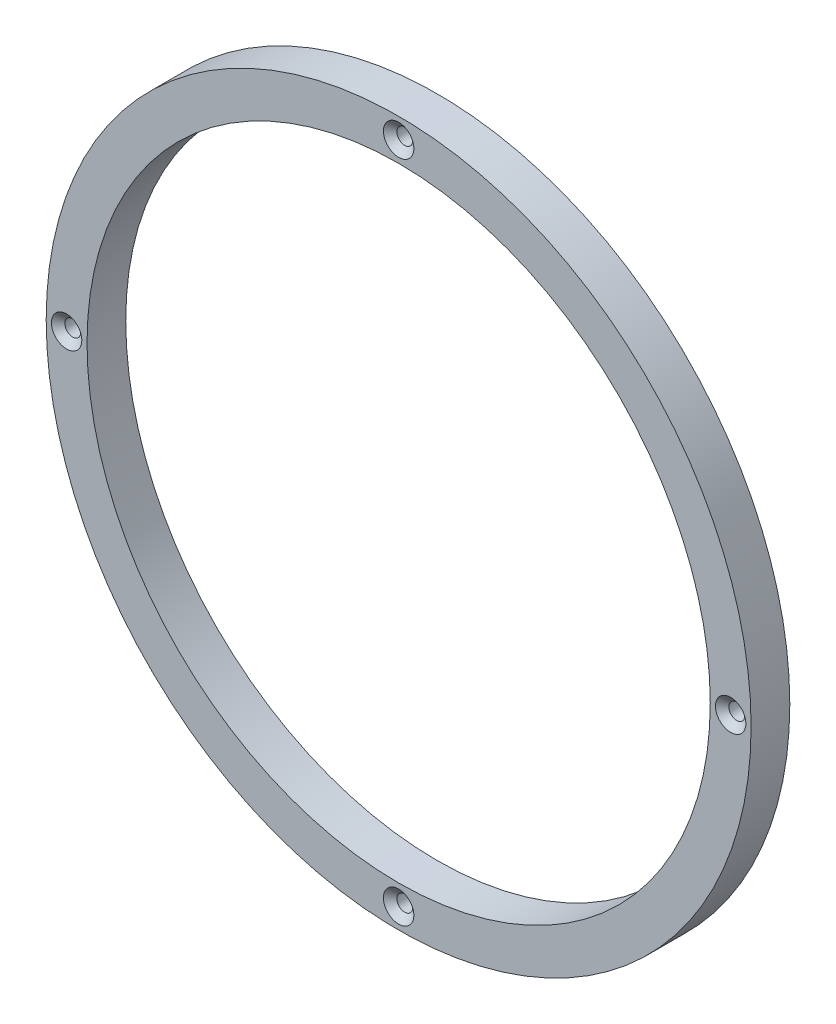
ISO-10303-21;
HEADER;
FILE_DESCRIPTION(('STEP AP214'),'2;1');
FILE_NAME('part.step','',(''),(''),'','','');
FILE_SCHEMA(('AUTOMOTIVE_DESIGN { 1 0 10303 214 1 1 1 1 }'));
ENDSEC;
DATA;
#1=APPLICATION_CONTEXT('core data for automotive mechanical design processes');
#2=APPLICATION_PROTOCOL_DEFINITION('international standard','automotive_design',2000,#1);
#3=PRODUCT_CONTEXT('',#1,'mechanical');
#4=PRODUCT('Part','Part','',(#3));
#5=PRODUCT_RELATED_PRODUCT_CATEGORY('part','',(#4));
#6=PRODUCT_DEFINITION_FORMATION('','',#4);
#7=PRODUCT_DEFINITION_CONTEXT('part definition',#1,'design');
#8=PRODUCT_DEFINITION('design','',#6,#7);
#9=PRODUCT_DEFINITION_SHAPE('','',#8);
#10=(LENGTH_UNIT() NAMED_UNIT(*) SI_UNIT(.MILLI.,.METRE.));
#11=(NAMED_UNIT(*) PLANE_ANGLE_UNIT() SI_UNIT($,.RADIAN.));
#12=(NAMED_UNIT(*) SI_UNIT($,.STERADIAN.) SOLID_ANGLE_UNIT());
#13=UNCERTAINTY_MEASURE_WITH_UNIT(LENGTH_MEASURE(1.E-05),#10,'distance_accuracy_value','');
#14=(GEOMETRIC_REPRESENTATION_CONTEXT(3) GLOBAL_UNCERTAINTY_ASSIGNED_CONTEXT((#13)) GLOBAL_UNIT_ASSIGNED_CONTEXT((#10,
#11,#12)) REPRESENTATION_CONTEXT('',''));
#15=CARTESIAN_POINT('',(0.,0.,0.));
#16=DIRECTION('',(0.,0.,1.));
#17=DIRECTION('',(1.,0.,0.));
#18=AXIS2_PLACEMENT_3D('',#15,#16,#17);
#19=CARTESIAN_POINT('',(0.,0.,12.446));
#20=DIRECTION('',(0.,0.,-1.));
#21=DIRECTION('',(-1.,0.,0.));
#22=AXIS2_PLACEMENT_3D('',#19,#20,#21);
#23=CYLINDRICAL_SURFACE('',#22,100.203);
#24=CARTESIAN_POINT('',(0.,0.,12.446));
#25=DIRECTION('',(0.,0.,1.));
#26=DIRECTION('',(1.,0.,0.));
#27=AXIS2_PLACEMENT_3D('',#24,#25,#26);
#28=CIRCLE('',#27,100.203);
#29=CARTESIAN_POINT('',(100.203,0.,12.446));
#30=VERTEX_POINT('',#29);
#31=EDGE_CURVE('E42',#30,#30,#28,.T.);
#32=ORIENTED_EDGE('',*,*,#31,.T.);
#33=EDGE_LOOP('',(#32));
#34=FACE_BOUND('',#33,.T.);
#35=CARTESIAN_POINT('',(0.,0.,0.));
#36=DIRECTION('',(0.,0.,1.));
#37=DIRECTION('',(1.,0.,0.));
#38=AXIS2_PLACEMENT_3D('',#35,#36,#37);
#39=CIRCLE('',#38,100.203);
#40=CARTESIAN_POINT('',(100.203,0.,0.));
#41=VERTEX_POINT('',#40);
#42=EDGE_CURVE('E49',#41,#41,#39,.T.);
#43=ORIENTED_EDGE('',*,*,#42,.F.);
#44=EDGE_LOOP('',(#43));
#45=FACE_BOUND('',#44,.T.);
#46=ADVANCED_FACE('F35',(#34,#45),#23,.F.);
#47=CARTESIAN_POINT('',(0.,0.,12.446));
#48=DIRECTION('',(0.,0.,-1.));
#49=DIRECTION('',(-1.,0.,0.));
#50=AXIS2_PLACEMENT_3D('',#47,#48,#49);
#51=CYLINDRICAL_SURFACE('',#50,113.3348);
#52=CARTESIAN_POINT('',(0.,0.,12.446));
#53=DIRECTION('',(0.,0.,1.));
#54=DIRECTION('',(1.,0.,0.));
#55=AXIS2_PLACEMENT_3D('',#52,#53,#54);
#56=CIRCLE('',#55,113.3348);
#57=CARTESIAN_POINT('',(113.3348,0.,12.446));
#58=VERTEX_POINT('',#57);
#59=EDGE_CURVE('E10',#58,#58,#56,.T.);
#60=ORIENTED_EDGE('',*,*,#59,.F.);
#61=EDGE_LOOP('',(#60));
#62=FACE_BOUND('',#61,.T.);
#63=CARTESIAN_POINT('',(0.,0.,0.));
#64=DIRECTION('',(0.,0.,1.));
#65=DIRECTION('',(1.,0.,0.));
#66=AXIS2_PLACEMENT_3D('',#63,#64,#65);
#67=CIRCLE('',#66,113.3348);
#68=CARTESIAN_POINT('',(113.3348,0.,0.));
#69=VERTEX_POINT('',#68);
#70=EDGE_CURVE('E38',#69,#69,#67,.T.);
#71=ORIENTED_EDGE('',*,*,#70,.T.);
#72=EDGE_LOOP('',(#71));
#73=FACE_BOUND('',#72,.T.);
#74=ADVANCED_FACE('F99',(#62,#73),#51,.T.);
#75=CARTESIAN_POINT('',(0.,0.,12.446));
#76=DIRECTION('',(0.,0.,1.));
#77=DIRECTION('',(1.,0.,0.));
#78=AXIS2_PLACEMENT_3D('',#75,#76,#77);
#79=PLANE('',#78);
#80=CARTESIAN_POINT('',(0.,-106.7689,12.446));
#81=DIRECTION('',(0.,0.,1.));
#82=DIRECTION('',(1.,0.,0.));
#83=AXIS2_PLACEMENT_3D('',#80,#81,#82);
#84=CIRCLE('',#83,4.8895);
#85=CARTESIAN_POINT('',(4.8895,-106.7689,12.446));
#86=VERTEX_POINT('',#85);
#87=EDGE_CURVE('E89',#86,#86,#84,.T.);
#88=ORIENTED_EDGE('',*,*,#87,.F.);
#89=EDGE_LOOP('',(#88));
#90=FACE_BOUND('',#89,.T.);
#91=CARTESIAN_POINT('',(0.,106.7689,12.446));
#92=DIRECTION('',(0.,0.,1.));
#93=DIRECTION('',(1.,0.,0.));
#94=AXIS2_PLACEMENT_3D('',#91,#92,#93);
#95=CIRCLE('',#94,4.8895);
#96=CARTESIAN_POINT('',(4.8895,106.7689,12.446));
#97=VERTEX_POINT('',#96);
#98=EDGE_CURVE('E80',#97,#97,#95,.T.);
#99=ORIENTED_EDGE('',*,*,#98,.F.);
#100=EDGE_LOOP('',(#99));
#101=FACE_BOUND('',#100,.T.);
#102=CARTESIAN_POINT('',(106.7689,0.,12.446));
#103=DIRECTION('',(0.,0.,1.));
#104=DIRECTION('',(1.,0.,0.));
#105=AXIS2_PLACEMENT_3D('',#102,#103,#104);
#106=CIRCLE('',#105,4.88950000000001);
#107=CARTESIAN_POINT('',(111.6584,0.,12.446));
#108=VERTEX_POINT('',#107);
#109=EDGE_CURVE('E71',#108,#108,#106,.T.);
#110=ORIENTED_EDGE('',*,*,#109,.F.);
#111=EDGE_LOOP('',(#110));
#112=FACE_BOUND('',#111,.T.);
#113=CARTESIAN_POINT('',(-106.7689,0.,12.446));
#114=DIRECTION('',(0.,0.,1.));
#115=DIRECTION('',(1.,0.,0.));
#116=AXIS2_PLACEMENT_3D('',#113,#114,#115);
#117=CIRCLE('',#116,4.88950000000001);
#118=CARTESIAN_POINT('',(-101.8794,0.,12.446));
#119=VERTEX_POINT('',#118);
#120=EDGE_CURVE('E60',#119,#119,#117,.T.);
#121=ORIENTED_EDGE('',*,*,#120,.F.);
#122=EDGE_LOOP('',(#121));
#123=FACE_BOUND('',#122,.T.);
#124=ORIENTED_EDGE('',*,*,#31,.F.);
#125=EDGE_LOOP('',(#124));
#126=FACE_BOUND('',#125,.T.);
#127=ORIENTED_EDGE('',*,*,#59,.T.);
#128=EDGE_LOOP('',(#127));
#129=FACE_BOUND('',#128,.T.);
#130=ADVANCED_FACE('F95',(#90,#101,#112,#123,#126,#129),#79,.T.);
#131=CARTESIAN_POINT('',(0.,0.,0.));
#132=DIRECTION('',(0.,0.,1.));
#133=DIRECTION('',(1.,0.,0.));
#134=AXIS2_PLACEMENT_3D('',#131,#132,#133);
#135=PLANE('',#134);
#136=CARTESIAN_POINT('',(0.,-106.7689,0.));
#137=DIRECTION('',(0.,0.,1.));
#138=DIRECTION('',(1.,0.,0.));
#139=AXIS2_PLACEMENT_3D('',#136,#137,#138);
#140=CIRCLE('',#139,2.5527);
#141=CARTESIAN_POINT('',(2.5527,-106.7689,0.));
#142=VERTEX_POINT('',#141);
#143=EDGE_CURVE('E83',#142,#142,#140,.T.);
#144=ORIENTED_EDGE('',*,*,#143,.T.);
#145=EDGE_LOOP('',(#144));
#146=FACE_BOUND('',#145,.T.);
#147=CARTESIAN_POINT('',(0.,106.7689,0.));
#148=DIRECTION('',(0.,0.,1.));
#149=DIRECTION('',(1.,0.,0.));
#150=AXIS2_PLACEMENT_3D('',#147,#148,#149);
#151=CIRCLE('',#150,2.5527);
#152=CARTESIAN_POINT('',(2.5527,106.7689,0.));
#153=VERTEX_POINT('',#152);
#154=EDGE_CURVE('E74',#153,#153,#151,.T.);
#155=ORIENTED_EDGE('',*,*,#154,.T.);
#156=EDGE_LOOP('',(#155));
#157=FACE_BOUND('',#156,.T.);
#158=CARTESIAN_POINT('',(106.7689,0.,0.));
#159=DIRECTION('',(0.,0.,1.));
#160=DIRECTION('',(1.,0.,0.));
#161=AXIS2_PLACEMENT_3D('',#158,#159,#160);
#162=CIRCLE('',#161,2.55270000000001);
#163=CARTESIAN_POINT('',(109.3216,0.,0.));
#164=VERTEX_POINT('',#163);
#165=EDGE_CURVE('E65',#164,#164,#162,.T.);
#166=ORIENTED_EDGE('',*,*,#165,.T.);
#167=EDGE_LOOP('',(#166));
#168=FACE_BOUND('',#167,.T.);
#169=CARTESIAN_POINT('',(-106.7689,0.,0.));
#170=DIRECTION('',(0.,0.,1.));
#171=DIRECTION('',(1.,0.,0.));
#172=AXIS2_PLACEMENT_3D('',#169,#170,#171);
#173=CIRCLE('',#172,2.55270000000001);
#174=CARTESIAN_POINT('',(-104.2162,0.,0.));
#175=VERTEX_POINT('',#174);
#176=EDGE_CURVE('E51',#175,#175,#173,.T.);
#177=ORIENTED_EDGE('',*,*,#176,.T.);
#178=EDGE_LOOP('',(#177));
#179=FACE_BOUND('',#178,.T.);
#180=ORIENTED_EDGE('',*,*,#42,.T.);
#181=EDGE_LOOP('',(#180));
#182=FACE_BOUND('',#181,.T.);
#183=ORIENTED_EDGE('',*,*,#70,.F.);
#184=EDGE_LOOP('',(#183));
#185=FACE_BOUND('',#184,.T.);
#186=ADVANCED_FACE('F98',(#146,#157,#168,#179,#182,#185),#135,.F.);
#187=CARTESIAN_POINT('',(-106.7689,0.,12.446));
#188=DIRECTION('',(0.,0.,1.));
#189=DIRECTION('',(1.,0.,0.));
#190=AXIS2_PLACEMENT_3D('',#187,#188,#189);
#191=CYLINDRICAL_SURFACE('',#190,2.5527);
#192=ORIENTED_EDGE('',*,*,#176,.F.);
#193=EDGE_LOOP('',(#192));
#194=FACE_BOUND('',#193,.T.);
#195=CARTESIAN_POINT('',(-106.7689,0.,10.4851919818649));
#196=DIRECTION('',(0.,0.,1.));
#197=DIRECTION('',(1.,0.,0.));
#198=AXIS2_PLACEMENT_3D('',#195,#196,#197);
#199=CIRCLE('',#198,2.55269999999999);
#200=CARTESIAN_POINT('',(-104.2162,0.,10.4851919818649));
#201=VERTEX_POINT('',#200);
#202=EDGE_CURVE('E56',#201,#201,#199,.T.);
#203=ORIENTED_EDGE('',*,*,#202,.T.);
#204=EDGE_LOOP('',(#203));
#205=FACE_BOUND('',#204,.T.);
#206=ADVANCED_FACE('F120',(#194,#205),#191,.F.);
#207=CARTESIAN_POINT('',(-106.7689,0.,12.446));
#208=DIRECTION('',(0.,0.,1.));
#209=DIRECTION('',(1.,0.,0.));
#210=AXIS2_PLACEMENT_3D('',#207,#208,#209);
#211=CONICAL_SURFACE('',#210,4.88950000000001,0.872664625997166);
#212=ORIENTED_EDGE('',*,*,#202,.F.);
#213=EDGE_LOOP('',(#212));
#214=FACE_BOUND('',#213,.T.);
#215=ORIENTED_EDGE('',*,*,#120,.T.);
#216=EDGE_LOOP('',(#215));
#217=FACE_BOUND('',#216,.T.);
#218=ADVANCED_FACE('F125',(#214,#217),#211,.F.);
#219=CARTESIAN_POINT('',(106.7689,0.,12.446));
#220=DIRECTION('',(0.,0.,1.));
#221=DIRECTION('',(1.,0.,0.));
#222=AXIS2_PLACEMENT_3D('',#219,#220,#221);
#223=CYLINDRICAL_SURFACE('',#222,2.5527);
#224=ORIENTED_EDGE('',*,*,#165,.F.);
#225=EDGE_LOOP('',(#224));
#226=FACE_BOUND('',#225,.T.);
#227=CARTESIAN_POINT('',(106.7689,0.,10.4851919818649));
#228=DIRECTION('',(0.,0.,1.));
#229=DIRECTION('',(1.,0.,0.));
#230=AXIS2_PLACEMENT_3D('',#227,#228,#229);
#231=CIRCLE('',#230,2.55269999999999);
#232=CARTESIAN_POINT('',(109.3216,0.,10.4851919818649));
#233=VERTEX_POINT('',#232);
#234=EDGE_CURVE('E68',#233,#233,#231,.T.);
#235=ORIENTED_EDGE('',*,*,#234,.T.);
#236=EDGE_LOOP('',(#235));
#237=FACE_BOUND('',#236,.T.);
#238=ADVANCED_FACE('F129',(#226,#237),#223,.F.);
#239=CARTESIAN_POINT('',(106.7689,0.,12.446));
#240=DIRECTION('',(0.,0.,1.));
#241=DIRECTION('',(1.,0.,0.));
#242=AXIS2_PLACEMENT_3D('',#239,#240,#241);
#243=CONICAL_SURFACE('',#242,4.88950000000001,0.872664625997166);
#244=ORIENTED_EDGE('',*,*,#234,.F.);
#245=EDGE_LOOP('',(#244));
#246=FACE_BOUND('',#245,.T.);
#247=ORIENTED_EDGE('',*,*,#109,.T.);
#248=EDGE_LOOP('',(#247));
#249=FACE_BOUND('',#248,.T.);
#250=ADVANCED_FACE('F133',(#246,#249),#243,.F.);
#251=CARTESIAN_POINT('',(0.,106.7689,12.446));
#252=DIRECTION('',(0.,0.,1.));
#253=DIRECTION('',(1.,0.,0.));
#254=AXIS2_PLACEMENT_3D('',#251,#252,#253);
#255=CYLINDRICAL_SURFACE('',#254,2.55269999999999);
#256=ORIENTED_EDGE('',*,*,#154,.F.);
#257=EDGE_LOOP('',(#256));
#258=FACE_BOUND('',#257,.T.);
#259=CARTESIAN_POINT('',(0.,106.7689,10.4851919818649));
#260=DIRECTION('',(0.,0.,1.));
#261=DIRECTION('',(1.,0.,0.));
#262=AXIS2_PLACEMENT_3D('',#259,#260,#261);
#263=CIRCLE('',#262,2.55269999999999);
#264=CARTESIAN_POINT('',(2.55269999999999,106.7689,10.4851919818649));
#265=VERTEX_POINT('',#264);
#266=EDGE_CURVE('E77',#265,#265,#263,.T.);
#267=ORIENTED_EDGE('',*,*,#266,.T.);
#268=EDGE_LOOP('',(#267));
#269=FACE_BOUND('',#268,.T.);
#270=ADVANCED_FACE('F137',(#258,#269),#255,.F.);
#271=CARTESIAN_POINT('',(0.,106.7689,12.446));
#272=DIRECTION('',(0.,0.,1.));
#273=DIRECTION('',(1.,0.,0.));
#274=AXIS2_PLACEMENT_3D('',#271,#272,#273);
#275=CONICAL_SURFACE('',#274,4.8895,0.872664625997166);
#276=ORIENTED_EDGE('',*,*,#266,.F.);
#277=EDGE_LOOP('',(#276));
#278=FACE_BOUND('',#277,.T.);
#279=ORIENTED_EDGE('',*,*,#98,.T.);
#280=EDGE_LOOP('',(#279));
#281=FACE_BOUND('',#280,.T.);
#282=ADVANCED_FACE('F141',(#278,#281),#275,.F.);
#283=CARTESIAN_POINT('',(0.,-106.7689,12.446));
#284=DIRECTION('',(0.,0.,1.));
#285=DIRECTION('',(1.,0.,0.));
#286=AXIS2_PLACEMENT_3D('',#283,#284,#285);
#287=CYLINDRICAL_SURFACE('',#286,2.55269999999999);
#288=ORIENTED_EDGE('',*,*,#143,.F.);
#289=EDGE_LOOP('',(#288));
#290=FACE_BOUND('',#289,.T.);
#291=CARTESIAN_POINT('',(0.,-106.7689,10.4851919818649));
#292=DIRECTION('',(0.,0.,1.));
#293=DIRECTION('',(1.,0.,0.));
#294=AXIS2_PLACEMENT_3D('',#291,#292,#293);
#295=CIRCLE('',#294,2.55269999999999);
#296=CARTESIAN_POINT('',(2.55269999999999,-106.7689,10.4851919818649));
#297=VERTEX_POINT('',#296);
#298=EDGE_CURVE('E86',#297,#297,#295,.T.);
#299=ORIENTED_EDGE('',*,*,#298,.T.);
#300=EDGE_LOOP('',(#299));
#301=FACE_BOUND('',#300,.T.);
#302=ADVANCED_FACE('F145',(#290,#301),#287,.F.);
#303=CARTESIAN_POINT('',(0.,-106.7689,12.446));
#304=DIRECTION('',(0.,0.,1.));
#305=DIRECTION('',(1.,0.,0.));
#306=AXIS2_PLACEMENT_3D('',#303,#304,#305);
#307=CONICAL_SURFACE('',#306,4.8895,0.872664625997166);
#308=ORIENTED_EDGE('',*,*,#298,.F.);
#309=EDGE_LOOP('',(#308));
#310=FACE_BOUND('',#309,.T.);
#311=ORIENTED_EDGE('',*,*,#87,.T.);
#312=EDGE_LOOP('',(#311));
#313=FACE_BOUND('',#312,.T.);
#314=ADVANCED_FACE('F93',(#310,#313),#307,.F.);
#315=CLOSED_SHELL('',(#46,#74,#130,#186,#206,#218,#238,#250,#270,#282,#302,#314));
#316=MANIFOLD_SOLID_BREP('B2',#315);
#317=ADVANCED_BREP_SHAPE_REPRESENTATION('',(#18,#316),#14);
#318=SHAPE_DEFINITION_REPRESENTATION(#9,#317);
ENDSEC;
END-ISO-10303-21;
